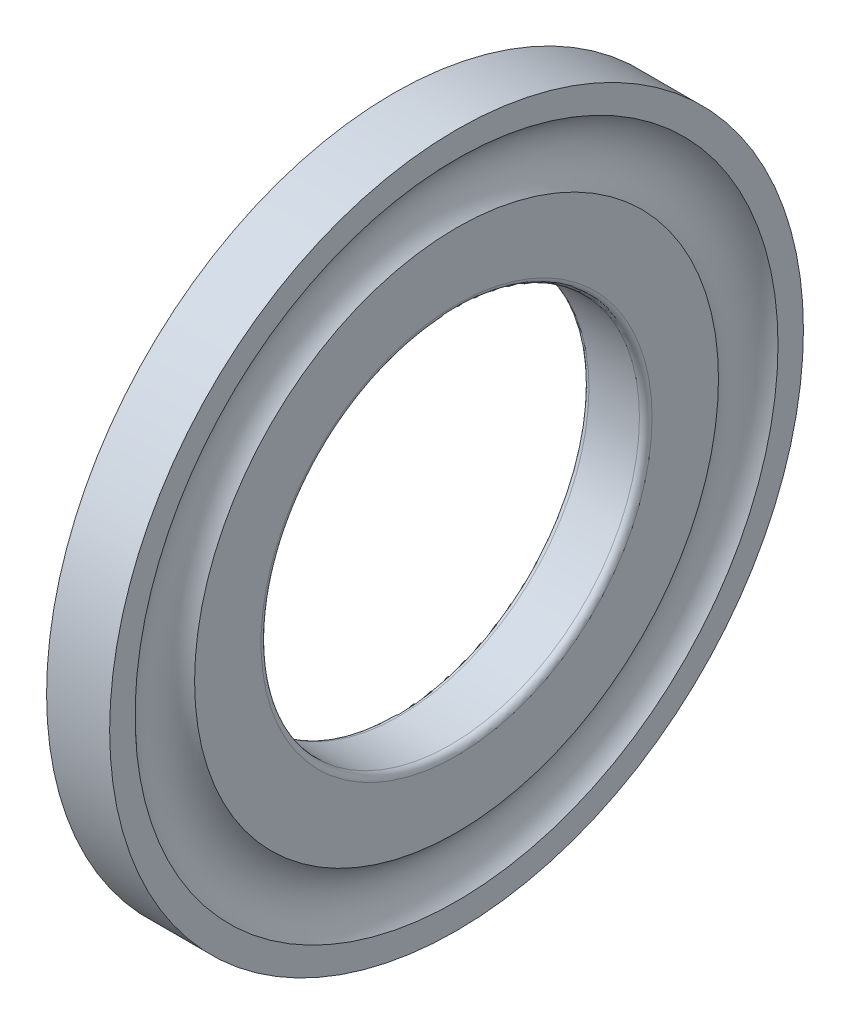
ISO-10303-21;
HEADER;
FILE_DESCRIPTION(('STEP AP214'),'2;1');
FILE_NAME('part.step','',(''),(''),'','','');
FILE_SCHEMA(('AUTOMOTIVE_DESIGN { 1 0 10303 214 1 1 1 1 }'));
ENDSEC;
DATA;
#1=APPLICATION_CONTEXT('core data for automotive mechanical design processes');
#2=APPLICATION_PROTOCOL_DEFINITION('international standard','automotive_design',2000,#1);
#3=PRODUCT_CONTEXT('',#1,'mechanical');
#4=PRODUCT('Part','Part','',(#3));
#5=PRODUCT_RELATED_PRODUCT_CATEGORY('part','',(#4));
#6=PRODUCT_DEFINITION_FORMATION('','',#4);
#7=PRODUCT_DEFINITION_CONTEXT('part definition',#1,'design');
#8=PRODUCT_DEFINITION('design','',#6,#7);
#9=PRODUCT_DEFINITION_SHAPE('','',#8);
#10=(LENGTH_UNIT() NAMED_UNIT(*) SI_UNIT(.MILLI.,.METRE.));
#11=(NAMED_UNIT(*) PLANE_ANGLE_UNIT() SI_UNIT($,.RADIAN.));
#12=(NAMED_UNIT(*) SI_UNIT($,.STERADIAN.) SOLID_ANGLE_UNIT());
#13=UNCERTAINTY_MEASURE_WITH_UNIT(LENGTH_MEASURE(1.E-05),#10,'distance_accuracy_value','');
#14=(GEOMETRIC_REPRESENTATION_CONTEXT(3) GLOBAL_UNCERTAINTY_ASSIGNED_CONTEXT((#13)) GLOBAL_UNIT_ASSIGNED_CONTEXT((#10,
#11,#12)) REPRESENTATION_CONTEXT('',''));
#15=CARTESIAN_POINT('',(0.,0.,0.));
#16=DIRECTION('',(0.,0.,1.));
#17=DIRECTION('',(1.,0.,0.));
#18=AXIS2_PLACEMENT_3D('',#15,#16,#17);
#19=CARTESIAN_POINT('',(28.5,0.,0.));
#20=DIRECTION('',(-1.,0.,0.));
#21=DIRECTION('',(0.,0.,1.));
#22=AXIS2_PLACEMENT_3D('',#19,#20,#21);
#23=CYLINDRICAL_SURFACE('',#22,30.);
#24=CARTESIAN_POINT('',(19.5,0.,0.));
#25=DIRECTION('',(1.,0.,0.));
#26=DIRECTION('',(0.,0.,-1.));
#27=AXIS2_PLACEMENT_3D('',#24,#25,#26);
#28=CIRCLE('',#27,30.);
#29=CARTESIAN_POINT('',(19.5,0.,-30.));
#30=VERTEX_POINT('',#29);
#31=EDGE_CURVE('E57',#30,#30,#28,.T.);
#32=ORIENTED_EDGE('',*,*,#31,.F.);
#33=EDGE_LOOP('',(#32));
#34=FACE_BOUND('',#33,.T.);
#35=CARTESIAN_POINT('',(27.5,0.,0.));
#36=DIRECTION('',(1.,0.,0.));
#37=DIRECTION('',(0.,0.,-1.));
#38=AXIS2_PLACEMENT_3D('',#35,#36,#37);
#39=CIRCLE('',#38,30.);
#40=CARTESIAN_POINT('',(27.5,0.,-30.));
#41=VERTEX_POINT('',#40);
#42=EDGE_CURVE('E52',#41,#41,#39,.F.);
#43=ORIENTED_EDGE('',*,*,#42,.F.);
#44=EDGE_LOOP('',(#43));
#45=FACE_BOUND('',#44,.T.);
#46=ADVANCED_FACE('F15',(#34,#45),#23,.F.);
#47=CARTESIAN_POINT('',(19.5,0.,0.));
#48=DIRECTION('',(1.,0.,0.));
#49=DIRECTION('',(0.,0.,-1.));
#50=AXIS2_PLACEMENT_3D('',#47,#48,#49);
#51=TOROIDAL_SURFACE('',#50,31.,1.00000000000001);
#52=CARTESIAN_POINT('',(18.5,0.,0.));
#53=DIRECTION('',(-1.,0.,0.));
#54=DIRECTION('',(0.,0.,-1.));
#55=AXIS2_PLACEMENT_3D('',#52,#53,#54);
#56=CIRCLE('',#55,31.);
#57=CARTESIAN_POINT('',(18.5,0.,-31.));
#58=VERTEX_POINT('',#57);
#59=EDGE_CURVE('E47',#58,#58,#56,.F.);
#60=ORIENTED_EDGE('',*,*,#59,.F.);
#61=EDGE_LOOP('',(#60));
#62=FACE_BOUND('',#61,.T.);
#63=ORIENTED_EDGE('',*,*,#31,.T.);
#64=EDGE_LOOP('',(#63));
#65=FACE_BOUND('',#64,.T.);
#66=ADVANCED_FACE('F86',(#62,#65),#51,.T.);
#67=CARTESIAN_POINT('',(27.5,0.,0.));
#68=DIRECTION('',(1.,0.,0.));
#69=DIRECTION('',(0.,0.,-1.));
#70=AXIS2_PLACEMENT_3D('',#67,#68,#69);
#71=TOROIDAL_SURFACE('',#70,31.,1.00000000000001);
#72=ORIENTED_EDGE('',*,*,#42,.T.);
#73=EDGE_LOOP('',(#72));
#74=FACE_BOUND('',#73,.T.);
#75=CARTESIAN_POINT('',(28.5,0.,0.));
#76=DIRECTION('',(1.,0.,0.));
#77=DIRECTION('',(0.,0.,-1.));
#78=AXIS2_PLACEMENT_3D('',#75,#76,#77);
#79=CIRCLE('',#78,31.);
#80=CARTESIAN_POINT('',(28.5,0.,-31.));
#81=VERTEX_POINT('',#80);
#82=EDGE_CURVE('E43',#81,#81,#79,.F.);
#83=ORIENTED_EDGE('',*,*,#82,.F.);
#84=EDGE_LOOP('',(#83));
#85=FACE_BOUND('',#84,.T.);
#86=ADVANCED_FACE('F76',(#74,#85),#71,.T.);
#87=CARTESIAN_POINT('',(18.5,41.5319495551658,0.));
#88=DIRECTION('',(-1.,0.,0.));
#89=DIRECTION('',(0.,0.,1.));
#90=AXIS2_PLACEMENT_3D('',#87,#88,#89);
#91=PLANE('',#90);
#92=CARTESIAN_POINT('',(18.5,0.,0.));
#93=DIRECTION('',(1.,0.,0.));
#94=DIRECTION('',(0.,0.,-1.));
#95=AXIS2_PLACEMENT_3D('',#92,#93,#94);
#96=CIRCLE('',#95,41.5319495551658);
#97=CARTESIAN_POINT('',(18.5,0.,-41.5319495551658));
#98=VERTEX_POINT('',#97);
#99=EDGE_CURVE('E18',#98,#98,#96,.F.);
#100=ORIENTED_EDGE('',*,*,#99,.T.);
#101=EDGE_LOOP('',(#100));
#102=FACE_BOUND('',#101,.T.);
#103=ORIENTED_EDGE('',*,*,#59,.T.);
#104=EDGE_LOOP('',(#103));
#105=FACE_BOUND('',#104,.T.);
#106=ADVANCED_FACE('F85',(#102,#105),#91,.T.);
#107=CARTESIAN_POINT('',(28.5,31.,0.));
#108=DIRECTION('',(1.,0.,0.));
#109=DIRECTION('',(0.,0.,-1.));
#110=AXIS2_PLACEMENT_3D('',#107,#108,#109);
#111=PLANE('',#110);
#112=ORIENTED_EDGE('',*,*,#82,.T.);
#113=EDGE_LOOP('',(#112));
#114=FACE_BOUND('',#113,.T.);
#115=CARTESIAN_POINT('',(28.5,0.,0.));
#116=DIRECTION('',(1.,0.,0.));
#117=DIRECTION('',(0.,0.,-1.));
#118=AXIS2_PLACEMENT_3D('',#115,#116,#117);
#119=CIRCLE('',#118,41.5319495551658);
#120=CARTESIAN_POINT('',(28.5,0.,-41.5319495551658));
#121=VERTEX_POINT('',#120);
#122=EDGE_CURVE('E38',#121,#121,#119,.T.);
#123=ORIENTED_EDGE('',*,*,#122,.T.);
#124=EDGE_LOOP('',(#123));
#125=FACE_BOUND('',#124,.T.);
#126=ADVANCED_FACE('F125',(#114,#125),#111,.T.);
#127=CARTESIAN_POINT('',(14.25,0.,0.));
#128=DIRECTION('',(1.,0.,0.));
#129=DIRECTION('',(0.,0.,-1.));
#130=AXIS2_PLACEMENT_3D('',#127,#128,#129);
#131=TOROIDAL_SURFACE('',#130,46.25,6.35000000000001);
#132=ORIENTED_EDGE('',*,*,#99,.F.);
#133=EDGE_LOOP('',(#132));
#134=FACE_BOUND('',#133,.T.);
#135=CARTESIAN_POINT('',(18.5,0.,0.));
#136=DIRECTION('',(1.,0.,0.));
#137=DIRECTION('',(0.,0.,-1.));
#138=AXIS2_PLACEMENT_3D('',#135,#136,#137);
#139=CIRCLE('',#138,50.9680504448342);
#140=CARTESIAN_POINT('',(18.5,0.,-50.9680504448342));
#141=VERTEX_POINT('',#140);
#142=EDGE_CURVE('E36',#141,#141,#139,.T.);
#143=ORIENTED_EDGE('',*,*,#142,.F.);
#144=EDGE_LOOP('',(#143));
#145=FACE_BOUND('',#144,.T.);
#146=ADVANCED_FACE('F117',(#134,#145),#131,.F.);
#147=CARTESIAN_POINT('',(32.75,0.,0.));
#148=DIRECTION('',(1.,0.,0.));
#149=DIRECTION('',(0.,0.,-1.));
#150=AXIS2_PLACEMENT_3D('',#147,#148,#149);
#151=TOROIDAL_SURFACE('',#150,46.25,6.34999999999999);
#152=CARTESIAN_POINT('',(28.5,0.,0.));
#153=DIRECTION('',(1.,0.,0.));
#154=DIRECTION('',(0.,0.,-1.));
#155=AXIS2_PLACEMENT_3D('',#152,#153,#154);
#156=CIRCLE('',#155,50.9680504448342);
#157=CARTESIAN_POINT('',(28.5,0.,-50.9680504448342));
#158=VERTEX_POINT('',#157);
#159=EDGE_CURVE('E27',#158,#158,#156,.F.);
#160=ORIENTED_EDGE('',*,*,#159,.F.);
#161=EDGE_LOOP('',(#160));
#162=FACE_BOUND('',#161,.T.);
#163=ORIENTED_EDGE('',*,*,#122,.F.);
#164=EDGE_LOOP('',(#163));
#165=FACE_BOUND('',#164,.T.);
#166=ADVANCED_FACE('F112',(#162,#165),#151,.F.);
#167=CARTESIAN_POINT('',(18.5,55.,0.));
#168=DIRECTION('',(-1.,0.,0.));
#169=DIRECTION('',(0.,0.,1.));
#170=AXIS2_PLACEMENT_3D('',#167,#168,#169);
#171=PLANE('',#170);
#172=CARTESIAN_POINT('',(18.5,0.,0.));
#173=DIRECTION('',(-1.,0.,0.));
#174=DIRECTION('',(0.,0.,1.));
#175=AXIS2_PLACEMENT_3D('',#172,#173,#174);
#176=CIRCLE('',#175,55.);
#177=CARTESIAN_POINT('',(18.5,0.,55.));
#178=VERTEX_POINT('',#177);
#179=EDGE_CURVE('E22',#178,#178,#176,.F.);
#180=ORIENTED_EDGE('',*,*,#179,.F.);
#181=EDGE_LOOP('',(#180));
#182=FACE_BOUND('',#181,.T.);
#183=ORIENTED_EDGE('',*,*,#142,.T.);
#184=EDGE_LOOP('',(#183));
#185=FACE_BOUND('',#184,.T.);
#186=ADVANCED_FACE('F105',(#182,#185),#171,.T.);
#187=CARTESIAN_POINT('',(28.5,50.9680504448342,0.));
#188=DIRECTION('',(1.,0.,0.));
#189=DIRECTION('',(0.,0.,-1.));
#190=AXIS2_PLACEMENT_3D('',#187,#188,#189);
#191=PLANE('',#190);
#192=ORIENTED_EDGE('',*,*,#159,.T.);
#193=EDGE_LOOP('',(#192));
#194=FACE_BOUND('',#193,.T.);
#195=CARTESIAN_POINT('',(28.5,0.,0.));
#196=DIRECTION('',(-1.,0.,0.));
#197=DIRECTION('',(0.,0.,1.));
#198=AXIS2_PLACEMENT_3D('',#195,#196,#197);
#199=CIRCLE('',#198,55.);
#200=CARTESIAN_POINT('',(28.5,0.,55.));
#201=VERTEX_POINT('',#200);
#202=EDGE_CURVE('E10',#201,#201,#199,.T.);
#203=ORIENTED_EDGE('',*,*,#202,.F.);
#204=EDGE_LOOP('',(#203));
#205=FACE_BOUND('',#204,.T.);
#206=ADVANCED_FACE('F100',(#194,#205),#191,.T.);
#207=CARTESIAN_POINT('',(28.5,0.,0.));
#208=DIRECTION('',(-1.,0.,0.));
#209=DIRECTION('',(0.,0.,1.));
#210=AXIS2_PLACEMENT_3D('',#207,#208,#209);
#211=CYLINDRICAL_SURFACE('',#210,55.);
#212=ORIENTED_EDGE('',*,*,#202,.T.);
#213=EDGE_LOOP('',(#212));
#214=FACE_BOUND('',#213,.T.);
#215=ORIENTED_EDGE('',*,*,#179,.T.);
#216=EDGE_LOOP('',(#215));
#217=FACE_BOUND('',#216,.T.);
#218=ADVANCED_FACE('F98',(#214,#217),#211,.T.);
#219=CLOSED_SHELL('',(#46,#66,#86,#106,#126,#146,#166,#186,#206,#218));
#220=MANIFOLD_SOLID_BREP('B1',#219);
#221=ADVANCED_BREP_SHAPE_REPRESENTATION('',(#18,#220),#14);
#222=SHAPE_DEFINITION_REPRESENTATION(#9,#221);
ENDSEC;
END-ISO-10303-21;
